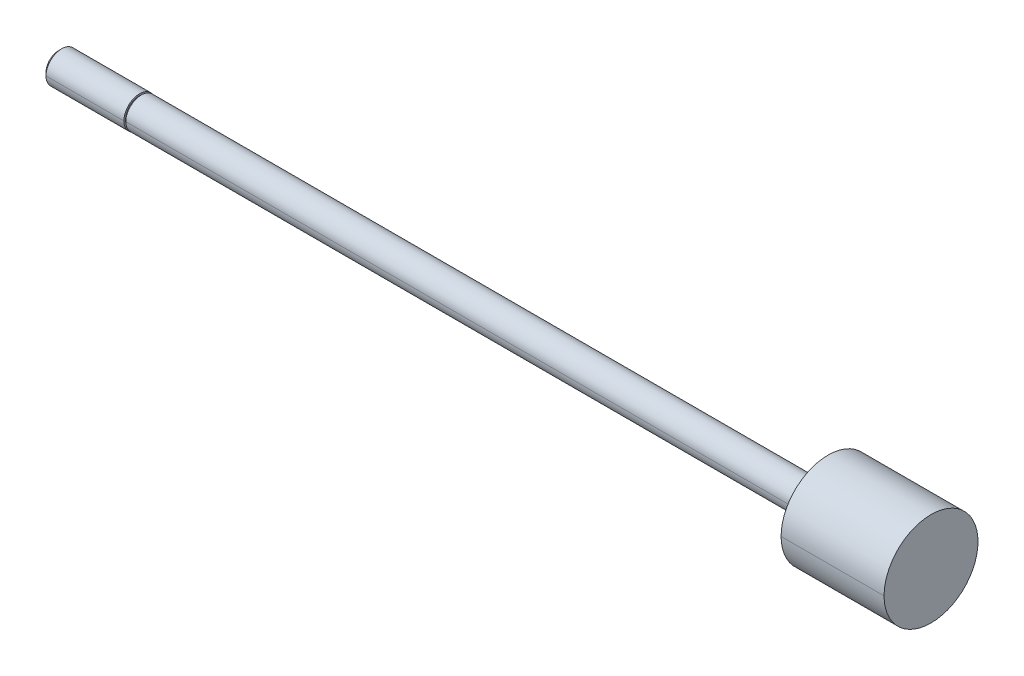
ISO-10303-21;
HEADER;
FILE_DESCRIPTION(('STEP AP214'),'2;1');
FILE_NAME('part.step','',(''),(''),'','','');
FILE_SCHEMA(('AUTOMOTIVE_DESIGN { 1 0 10303 214 1 1 1 1 }'));
ENDSEC;
DATA;
#1=APPLICATION_CONTEXT('core data for automotive mechanical design processes');
#2=APPLICATION_PROTOCOL_DEFINITION('international standard','automotive_design',2000,#1);
#3=PRODUCT_CONTEXT('',#1,'mechanical');
#4=PRODUCT('Part','Part','',(#3));
#5=PRODUCT_RELATED_PRODUCT_CATEGORY('part','',(#4));
#6=PRODUCT_DEFINITION_FORMATION('','',#4);
#7=PRODUCT_DEFINITION_CONTEXT('part definition',#1,'design');
#8=PRODUCT_DEFINITION('design','',#6,#7);
#9=PRODUCT_DEFINITION_SHAPE('','',#8);
#10=(LENGTH_UNIT() NAMED_UNIT(*) SI_UNIT(.MILLI.,.METRE.));
#11=(NAMED_UNIT(*) PLANE_ANGLE_UNIT() SI_UNIT($,.RADIAN.));
#12=(NAMED_UNIT(*) SI_UNIT($,.STERADIAN.) SOLID_ANGLE_UNIT());
#13=UNCERTAINTY_MEASURE_WITH_UNIT(LENGTH_MEASURE(1.E-05),#10,'distance_accuracy_value','');
#14=(GEOMETRIC_REPRESENTATION_CONTEXT(3) GLOBAL_UNCERTAINTY_ASSIGNED_CONTEXT((#13)) GLOBAL_UNIT_ASSIGNED_CONTEXT((#10,
#11,#12)) REPRESENTATION_CONTEXT('',''));
#15=CARTESIAN_POINT('',(0.,0.,0.));
#16=DIRECTION('',(0.,0.,1.));
#17=DIRECTION('',(1.,0.,0.));
#18=AXIS2_PLACEMENT_3D('',#15,#16,#17);
#19=CARTESIAN_POINT('',(0.,0.,0.));
#20=DIRECTION('',(-1.,0.,0.));
#21=DIRECTION('',(0.,-1.,0.));
#22=AXIS2_PLACEMENT_3D('',#19,#20,#21);
#23=CYLINDRICAL_SURFACE('',#22,2.159);
#24=CARTESIAN_POINT('',(0.,0.,0.));
#25=DIRECTION('',(1.,0.,0.));
#26=DIRECTION('',(0.,0.,-1.));
#27=AXIS2_PLACEMENT_3D('',#24,#25,#26);
#28=CIRCLE('',#27,2.159);
#29=CARTESIAN_POINT('',(0.,0.,-2.159));
#30=VERTEX_POINT('',#29);
#31=CARTESIAN_POINT('',(0.,0.,2.159));
#32=VERTEX_POINT('',#31);
#33=EDGE_CURVE('E11',#30,#32,#28,.T.);
#34=ORIENTED_EDGE('',*,*,#33,.F.);
#35=DIRECTION('',(-1.,0.,0.));
#36=VECTOR('',#35,1.);
#37=CARTESIAN_POINT('',(0.,0.,-2.159));
#38=LINE('',#37,#36);
#39=CARTESIAN_POINT('',(-0.254,0.,-2.159));
#40=VERTEX_POINT('',#39);
#41=EDGE_CURVE('E25',#30,#40,#38,.T.);
#42=ORIENTED_EDGE('',*,*,#41,.T.);
#43=CARTESIAN_POINT('',(-0.254,0.,0.));
#44=DIRECTION('',(1.,0.,0.));
#45=DIRECTION('',(0.,0.,-1.));
#46=AXIS2_PLACEMENT_3D('',#43,#44,#45);
#47=CIRCLE('',#46,2.159);
#48=CARTESIAN_POINT('',(-0.254,0.,2.159));
#49=VERTEX_POINT('',#48);
#50=EDGE_CURVE('E211',#40,#49,#47,.T.);
#51=ORIENTED_EDGE('',*,*,#50,.T.);
#52=DIRECTION('',(-1.,0.,0.));
#53=VECTOR('',#52,1.);
#54=CARTESIAN_POINT('',(0.,0.,2.159));
#55=LINE('',#54,#53);
#56=EDGE_CURVE('E206',#32,#49,#55,.T.);
#57=ORIENTED_EDGE('',*,*,#56,.F.);
#58=EDGE_LOOP('',(#34,#42,#51,#57));
#59=FACE_BOUND('',#58,.T.);
#60=ADVANCED_FACE('F17',(#59),#23,.T.);
#61=CARTESIAN_POINT('',(0.,0.,0.));
#62=DIRECTION('',(-1.,0.,0.));
#63=DIRECTION('',(0.,1.,0.));
#64=AXIS2_PLACEMENT_3D('',#61,#62,#63);
#65=CYLINDRICAL_SURFACE('',#64,2.159);
#66=CARTESIAN_POINT('',(-0.254,0.,0.));
#67=DIRECTION('',(1.,0.,0.));
#68=DIRECTION('',(0.,0.,-1.));
#69=AXIS2_PLACEMENT_3D('',#66,#67,#68);
#70=CIRCLE('',#69,2.159);
#71=EDGE_CURVE('E202',#49,#40,#70,.T.);
#72=ORIENTED_EDGE('',*,*,#71,.T.);
#73=ORIENTED_EDGE('',*,*,#41,.F.);
#74=CARTESIAN_POINT('',(0.,0.,0.));
#75=DIRECTION('',(1.,0.,0.));
#76=DIRECTION('',(0.,0.,-1.));
#77=AXIS2_PLACEMENT_3D('',#74,#75,#76);
#78=CIRCLE('',#77,2.159);
#79=EDGE_CURVE('E197',#32,#30,#78,.T.);
#80=ORIENTED_EDGE('',*,*,#79,.F.);
#81=ORIENTED_EDGE('',*,*,#56,.T.);
#82=EDGE_LOOP('',(#72,#73,#80,#81));
#83=FACE_BOUND('',#82,.T.);
#84=ADVANCED_FACE('F224',(#83),#65,.T.);
#85=CARTESIAN_POINT('',(0.,2.159,0.));
#86=DIRECTION('',(1.,0.,0.));
#87=DIRECTION('',(0.,0.,-1.));
#88=AXIS2_PLACEMENT_3D('',#85,#86,#87);
#89=PLANE('',#88);
#90=CARTESIAN_POINT('',(0.,0.,0.));
#91=DIRECTION('',(1.,0.,0.));
#92=DIRECTION('',(0.,0.,-1.));
#93=AXIS2_PLACEMENT_3D('',#90,#91,#92);
#94=CIRCLE('',#93,2.3749);
#95=CARTESIAN_POINT('',(0.,0.,-2.3749));
#96=VERTEX_POINT('',#95);
#97=CARTESIAN_POINT('',(0.,0.,2.3749));
#98=VERTEX_POINT('',#97);
#99=EDGE_CURVE('E192',#96,#98,#94,.T.);
#100=ORIENTED_EDGE('',*,*,#99,.F.);
#101=CARTESIAN_POINT('',(0.,0.,0.));
#102=DIRECTION('',(1.,0.,0.));
#103=DIRECTION('',(0.,0.,-1.));
#104=AXIS2_PLACEMENT_3D('',#101,#102,#103);
#105=CIRCLE('',#104,2.3749);
#106=EDGE_CURVE('E187',#98,#96,#105,.T.);
#107=ORIENTED_EDGE('',*,*,#106,.F.);
#108=EDGE_LOOP('',(#100,#107));
#109=FACE_BOUND('',#108,.T.);
#110=ORIENTED_EDGE('',*,*,#33,.T.);
#111=ORIENTED_EDGE('',*,*,#79,.T.);
#112=EDGE_LOOP('',(#110,#111));
#113=FACE_BOUND('',#112,.T.);
#114=ADVANCED_FACE('F249',(#109,#113),#89,.F.);
#115=CARTESIAN_POINT('',(121.3866,0.,0.));
#116=DIRECTION('',(-1.,0.,0.));
#117=DIRECTION('',(0.,1.,0.));
#118=AXIS2_PLACEMENT_3D('',#115,#116,#117);
#119=CYLINDRICAL_SURFACE('',#118,2.3749);
#120=ORIENTED_EDGE('',*,*,#106,.T.);
#121=DIRECTION('',(-1.,0.,0.));
#122=VECTOR('',#121,1.);
#123=CARTESIAN_POINT('',(105.5624,0.,-2.3749));
#124=LINE('',#123,#122);
#125=CARTESIAN_POINT('',(105.5624,0.,-2.3749));
#126=VERTEX_POINT('',#125);
#127=EDGE_CURVE('E182',#126,#96,#124,.T.);
#128=ORIENTED_EDGE('',*,*,#127,.F.);
#129=CARTESIAN_POINT('',(105.5624,0.,0.));
#130=DIRECTION('',(1.,0.,0.));
#131=DIRECTION('',(0.,0.,-1.));
#132=AXIS2_PLACEMENT_3D('',#129,#130,#131);
#133=CIRCLE('',#132,2.3749);
#134=CARTESIAN_POINT('',(105.5624,0.,2.3749));
#135=VERTEX_POINT('',#134);
#136=EDGE_CURVE('E177',#135,#126,#133,.T.);
#137=ORIENTED_EDGE('',*,*,#136,.F.);
#138=DIRECTION('',(-1.,0.,0.));
#139=VECTOR('',#138,1.);
#140=CARTESIAN_POINT('',(105.5624,0.,2.3749));
#141=LINE('',#140,#139);
#142=EDGE_CURVE('E172',#135,#98,#141,.T.);
#143=ORIENTED_EDGE('',*,*,#142,.T.);
#144=EDGE_LOOP('',(#120,#128,#137,#143));
#145=FACE_BOUND('',#144,.T.);
#146=ADVANCED_FACE('F253',(#145),#119,.T.);
#147=CARTESIAN_POINT('',(121.3866,0.,0.));
#148=DIRECTION('',(-1.,0.,0.));
#149=DIRECTION('',(0.,-1.,0.));
#150=AXIS2_PLACEMENT_3D('',#147,#148,#149);
#151=CYLINDRICAL_SURFACE('',#150,2.3749);
#152=CARTESIAN_POINT('',(105.5624,0.,0.));
#153=DIRECTION('',(1.,0.,0.));
#154=DIRECTION('',(0.,0.,-1.));
#155=AXIS2_PLACEMENT_3D('',#152,#153,#154);
#156=CIRCLE('',#155,2.3749);
#157=EDGE_CURVE('E167',#126,#135,#156,.T.);
#158=ORIENTED_EDGE('',*,*,#157,.F.);
#159=ORIENTED_EDGE('',*,*,#127,.T.);
#160=ORIENTED_EDGE('',*,*,#99,.T.);
#161=ORIENTED_EDGE('',*,*,#142,.F.);
#162=EDGE_LOOP('',(#158,#159,#160,#161));
#163=FACE_BOUND('',#162,.T.);
#164=ADVANCED_FACE('F259',(#163),#151,.T.);
#165=CARTESIAN_POINT('',(105.5624,2.3749,0.));
#166=DIRECTION('',(1.,0.,0.));
#167=DIRECTION('',(0.,0.,-1.));
#168=AXIS2_PLACEMENT_3D('',#165,#166,#167);
#169=PLANE('',#168);
#170=CARTESIAN_POINT('',(105.5624,0.,0.));
#171=DIRECTION('',(1.,0.,0.));
#172=DIRECTION('',(0.,0.,-1.));
#173=AXIS2_PLACEMENT_3D('',#170,#171,#172);
#174=CIRCLE('',#173,7.21995);
#175=CARTESIAN_POINT('',(105.5624,0.,-7.21995));
#176=VERTEX_POINT('',#175);
#177=CARTESIAN_POINT('',(105.5624,0.,7.21995));
#178=VERTEX_POINT('',#177);
#179=EDGE_CURVE('E162',#176,#178,#174,.T.);
#180=ORIENTED_EDGE('',*,*,#179,.F.);
#181=CARTESIAN_POINT('',(105.5624,0.,0.));
#182=DIRECTION('',(1.,0.,0.));
#183=DIRECTION('',(0.,0.,-1.));
#184=AXIS2_PLACEMENT_3D('',#181,#182,#183);
#185=CIRCLE('',#184,7.21995);
#186=EDGE_CURVE('E157',#178,#176,#185,.T.);
#187=ORIENTED_EDGE('',*,*,#186,.F.);
#188=EDGE_LOOP('',(#180,#187));
#189=FACE_BOUND('',#188,.T.);
#190=ORIENTED_EDGE('',*,*,#157,.T.);
#191=ORIENTED_EDGE('',*,*,#136,.T.);
#192=EDGE_LOOP('',(#190,#191));
#193=FACE_BOUND('',#192,.T.);
#194=ADVANCED_FACE('F263',(#189,#193),#169,.F.);
#195=CARTESIAN_POINT('',(121.3866,0.,0.));
#196=DIRECTION('',(-1.,0.,0.));
#197=DIRECTION('',(0.,1.,0.));
#198=AXIS2_PLACEMENT_3D('',#195,#196,#197);
#199=CYLINDRICAL_SURFACE('',#198,7.21995);
#200=ORIENTED_EDGE('',*,*,#186,.T.);
#201=DIRECTION('',(-1.,0.,0.));
#202=VECTOR('',#201,1.);
#203=CARTESIAN_POINT('',(121.3866,0.,-7.21995));
#204=LINE('',#203,#202);
#205=CARTESIAN_POINT('',(121.3866,0.,-7.21995));
#206=VERTEX_POINT('',#205);
#207=EDGE_CURVE('E152',#206,#176,#204,.T.);
#208=ORIENTED_EDGE('',*,*,#207,.F.);
#209=CARTESIAN_POINT('',(121.3866,0.,0.));
#210=DIRECTION('',(1.,0.,0.));
#211=DIRECTION('',(0.,0.,-1.));
#212=AXIS2_PLACEMENT_3D('',#209,#210,#211);
#213=CIRCLE('',#212,7.21995);
#214=CARTESIAN_POINT('',(121.3866,0.,7.21995));
#215=VERTEX_POINT('',#214);
#216=EDGE_CURVE('E147',#215,#206,#213,.T.);
#217=ORIENTED_EDGE('',*,*,#216,.F.);
#218=DIRECTION('',(-1.,0.,0.));
#219=VECTOR('',#218,1.);
#220=CARTESIAN_POINT('',(121.3866,0.,7.21995));
#221=LINE('',#220,#219);
#222=EDGE_CURVE('E142',#215,#178,#221,.T.);
#223=ORIENTED_EDGE('',*,*,#222,.T.);
#224=EDGE_LOOP('',(#200,#208,#217,#223));
#225=FACE_BOUND('',#224,.T.);
#226=ADVANCED_FACE('F267',(#225),#199,.T.);
#227=CARTESIAN_POINT('',(121.3866,0.,0.));
#228=DIRECTION('',(-1.,0.,0.));
#229=DIRECTION('',(0.,-1.,0.));
#230=AXIS2_PLACEMENT_3D('',#227,#228,#229);
#231=CYLINDRICAL_SURFACE('',#230,7.21995);
#232=CARTESIAN_POINT('',(121.3866,0.,0.));
#233=DIRECTION('',(1.,0.,0.));
#234=DIRECTION('',(0.,0.,-1.));
#235=AXIS2_PLACEMENT_3D('',#232,#233,#234);
#236=CIRCLE('',#235,7.21995);
#237=EDGE_CURVE('E137',#206,#215,#236,.T.);
#238=ORIENTED_EDGE('',*,*,#237,.F.);
#239=ORIENTED_EDGE('',*,*,#207,.T.);
#240=ORIENTED_EDGE('',*,*,#179,.T.);
#241=ORIENTED_EDGE('',*,*,#222,.F.);
#242=EDGE_LOOP('',(#238,#239,#240,#241));
#243=FACE_BOUND('',#242,.T.);
#244=ADVANCED_FACE('F271',(#243),#231,.T.);
#245=CARTESIAN_POINT('',(121.3866,7.21995,0.));
#246=DIRECTION('',(-1.,0.,0.));
#247=DIRECTION('',(0.,0.,1.));
#248=AXIS2_PLACEMENT_3D('',#245,#246,#247);
#249=PLANE('',#248);
#250=ORIENTED_EDGE('',*,*,#237,.T.);
#251=ORIENTED_EDGE('',*,*,#216,.T.);
#252=EDGE_LOOP('',(#250,#251));
#253=FACE_BOUND('',#252,.T.);
#254=ADVANCED_FACE('F229',(#253),#249,.F.);
#255=CARTESIAN_POINT('',(-0.254,2.667,0.));
#256=DIRECTION('',(-1.,0.,0.));
#257=DIRECTION('',(0.,0.,1.));
#258=AXIS2_PLACEMENT_3D('',#255,#256,#257);
#259=PLANE('',#258);
#260=ORIENTED_EDGE('',*,*,#50,.F.);
#261=ORIENTED_EDGE('',*,*,#71,.F.);
#262=EDGE_LOOP('',(#260,#261));
#263=FACE_BOUND('',#262,.T.);
#264=CARTESIAN_POINT('',(-0.254,0.,0.));
#265=DIRECTION('',(-1.,0.,0.));
#266=DIRECTION('',(0.,0.,1.));
#267=AXIS2_PLACEMENT_3D('',#264,#265,#266);
#268=CIRCLE('',#267,2.413);
#269=CARTESIAN_POINT('',(-0.254,0.,2.413));
#270=VERTEX_POINT('',#269);
#271=CARTESIAN_POINT('',(-0.254,0.,-2.413));
#272=VERTEX_POINT('',#271);
#273=EDGE_CURVE('E132',#270,#272,#268,.T.);
#274=ORIENTED_EDGE('',*,*,#273,.F.);
#275=CARTESIAN_POINT('',(-0.254,0.,0.));
#276=DIRECTION('',(-1.,0.,0.));
#277=DIRECTION('',(0.,0.,1.));
#278=AXIS2_PLACEMENT_3D('',#275,#276,#277);
#279=CIRCLE('',#278,2.413);
#280=EDGE_CURVE('E127',#272,#270,#279,.T.);
#281=ORIENTED_EDGE('',*,*,#280,.F.);
#282=EDGE_LOOP('',(#274,#281));
#283=FACE_BOUND('',#282,.T.);
#284=ADVANCED_FACE('F225',(#263,#283),#259,.F.);
#285=CARTESIAN_POINT('',(0.,0.,0.));
#286=DIRECTION('',(-1.,0.,0.));
#287=DIRECTION('',(0.,1.,0.));
#288=AXIS2_PLACEMENT_3D('',#285,#286,#287);
#289=CYLINDRICAL_SURFACE('',#288,2.413);
#290=CARTESIAN_POINT('',(-12.22756,0.,0.));
#291=DIRECTION('',(1.,0.,0.));
#292=DIRECTION('',(0.,0.,-1.));
#293=AXIS2_PLACEMENT_3D('',#290,#291,#292);
#294=CIRCLE('',#293,2.413);
#295=CARTESIAN_POINT('',(-12.2275600000012,0.,2.41300000000121));
#296=VERTEX_POINT('',#295);
#297=CARTESIAN_POINT('',(-12.22756,0.,-2.413));
#298=VERTEX_POINT('',#297);
#299=EDGE_CURVE('E98',#296,#298,#294,.T.);
#300=ORIENTED_EDGE('',*,*,#299,.T.);
#301=DIRECTION('',(-1.,0.,0.));
#302=VECTOR('',#301,1.);
#303=CARTESIAN_POINT('',(-0.254,0.,-2.413));
#304=LINE('',#303,#302);
#305=EDGE_CURVE('E119',#272,#298,#304,.T.);
#306=ORIENTED_EDGE('',*,*,#305,.F.);
#307=ORIENTED_EDGE('',*,*,#280,.T.);
#308=DIRECTION('',(-1.,0.,0.));
#309=VECTOR('',#308,1.);
#310=CARTESIAN_POINT('',(-0.254,0.,2.413));
#311=LINE('',#310,#309);
#312=EDGE_CURVE('E115',#270,#296,#311,.T.);
#313=ORIENTED_EDGE('',*,*,#312,.T.);
#314=EDGE_LOOP('',(#300,#306,#307,#313));
#315=FACE_BOUND('',#314,.T.);
#316=ADVANCED_FACE('F228',(#315),#289,.T.);
#317=CARTESIAN_POINT('',(0.,0.,0.));
#318=DIRECTION('',(-1.,0.,0.));
#319=DIRECTION('',(0.,-1.,0.));
#320=AXIS2_PLACEMENT_3D('',#317,#318,#319);
#321=CYLINDRICAL_SURFACE('',#320,2.413);
#322=ORIENTED_EDGE('',*,*,#273,.T.);
#323=ORIENTED_EDGE('',*,*,#305,.T.);
#324=CARTESIAN_POINT('',(-12.22756,0.,0.));
#325=DIRECTION('',(1.,0.,0.));
#326=DIRECTION('',(0.,0.,-1.));
#327=AXIS2_PLACEMENT_3D('',#324,#325,#326);
#328=CIRCLE('',#327,2.413);
#329=EDGE_CURVE('E110',#298,#296,#328,.T.);
#330=ORIENTED_EDGE('',*,*,#329,.T.);
#331=ORIENTED_EDGE('',*,*,#312,.F.);
#332=EDGE_LOOP('',(#322,#323,#330,#331));
#333=FACE_BOUND('',#332,.T.);
#334=ADVANCED_FACE('F235',(#333),#321,.T.);
#335=CARTESIAN_POINT('',(-12.7,0.,0.));
#336=DIRECTION('',(1.,0.,0.));
#337=DIRECTION('',(0.,-1.,0.));
#338=AXIS2_PLACEMENT_3D('',#335,#336,#337);
#339=CONICAL_SURFACE('',#338,1.94056,0.7853981634);
#340=ORIENTED_EDGE('',*,*,#329,.F.);
#341=DIRECTION('',(0.707106781184743,0.,-0.707106781188352));
#342=VECTOR('',#341,1.);
#343=CARTESIAN_POINT('',(-12.7,0.,-1.94056));
#344=LINE('',#343,#342);
#345=CARTESIAN_POINT('',(-12.7,0.,-1.94056));
#346=VERTEX_POINT('',#345);
#347=EDGE_CURVE('E90',#346,#298,#344,.T.);
#348=ORIENTED_EDGE('',*,*,#347,.F.);
#349=CARTESIAN_POINT('',(-12.7,0.,0.));
#350=DIRECTION('',(1.,0.,0.));
#351=DIRECTION('',(0.,0.,-1.));
#352=AXIS2_PLACEMENT_3D('',#349,#350,#351);
#353=CIRCLE('',#352,1.94056);
#354=CARTESIAN_POINT('',(-12.7,0.,1.94056));
#355=VERTEX_POINT('',#354);
#356=EDGE_CURVE('E83',#346,#355,#353,.T.);
#357=ORIENTED_EDGE('',*,*,#356,.T.);
#358=DIRECTION('',(0.707106781184743,0.,0.707106781188352));
#359=VECTOR('',#358,1.);
#360=CARTESIAN_POINT('',(-12.7,0.,1.94056));
#361=LINE('',#360,#359);
#362=EDGE_CURVE('E87',#355,#296,#361,.T.);
#363=ORIENTED_EDGE('',*,*,#362,.T.);
#364=EDGE_LOOP('',(#340,#348,#357,#363));
#365=FACE_BOUND('',#364,.T.);
#366=ADVANCED_FACE('F86',(#365),#339,.T.);
#367=CARTESIAN_POINT('',(-12.7,0.,0.));
#368=DIRECTION('',(1.,0.,0.));
#369=DIRECTION('',(0.,1.,0.));
#370=AXIS2_PLACEMENT_3D('',#367,#368,#369);
#371=CONICAL_SURFACE('',#370,1.94056,0.7853981634);
#372=CARTESIAN_POINT('',(-12.7,0.,0.));
#373=DIRECTION('',(1.,0.,0.));
#374=DIRECTION('',(0.,0.,-1.));
#375=AXIS2_PLACEMENT_3D('',#372,#373,#374);
#376=CIRCLE('',#375,1.94056);
#377=EDGE_CURVE('E97',#355,#346,#376,.T.);
#378=ORIENTED_EDGE('',*,*,#377,.T.);
#379=ORIENTED_EDGE('',*,*,#347,.T.);
#380=ORIENTED_EDGE('',*,*,#299,.F.);
#381=ORIENTED_EDGE('',*,*,#362,.F.);
#382=EDGE_LOOP('',(#378,#379,#380,#381));
#383=FACE_BOUND('',#382,.T.);
#384=ADVANCED_FACE('F96',(#383),#371,.T.);
#385=CARTESIAN_POINT('',(-12.7,0.,0.));
#386=DIRECTION('',(1.,0.,0.));
#387=DIRECTION('',(0.,0.,-1.));
#388=AXIS2_PLACEMENT_3D('',#385,#386,#387);
#389=PLANE('',#388);
#390=ORIENTED_EDGE('',*,*,#356,.F.);
#391=ORIENTED_EDGE('',*,*,#377,.F.);
#392=EDGE_LOOP('',(#390,#391));
#393=FACE_BOUND('',#392,.T.);
#394=ADVANCED_FACE('F100',(#393),#389,.F.);
#395=CLOSED_SHELL('',(#60,#84,#114,#146,#164,#194,#226,#244,#254,#284,#316,#334,#366,#384,#394));
#396=MANIFOLD_SOLID_BREP('B1',#395);
#397=ADVANCED_BREP_SHAPE_REPRESENTATION('',(#18,#396),#14);
#398=SHAPE_DEFINITION_REPRESENTATION(#9,#397);
ENDSEC;
END-ISO-10303-21;
